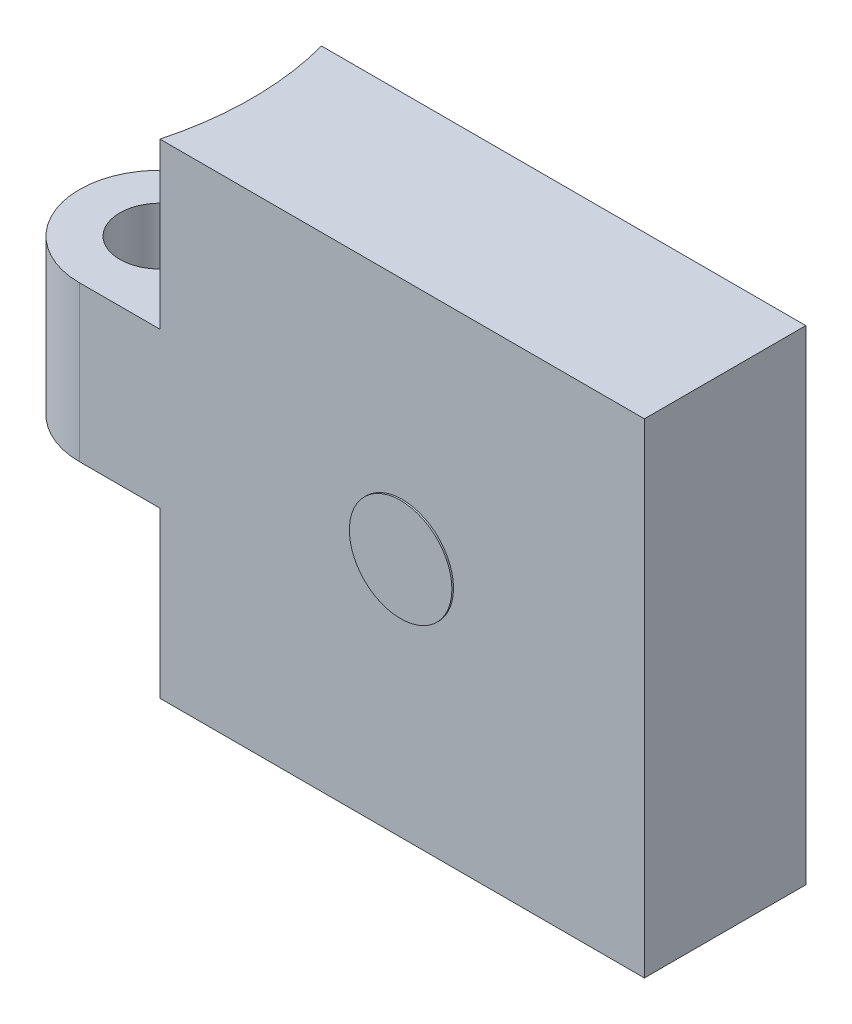
ISO-10303-21;
HEADER;
FILE_DESCRIPTION(('STEP AP214'),'2;1');
FILE_NAME('part.step','',(''),(''),'','','');
FILE_SCHEMA(('AUTOMOTIVE_DESIGN { 1 0 10303 214 1 1 1 1 }'));
ENDSEC;
DATA;
#1=APPLICATION_CONTEXT('core data for automotive mechanical design processes');
#2=APPLICATION_PROTOCOL_DEFINITION('international standard','automotive_design',2000,#1);
#3=PRODUCT_CONTEXT('',#1,'mechanical');
#4=PRODUCT('Part','Part','',(#3));
#5=PRODUCT_RELATED_PRODUCT_CATEGORY('part','',(#4));
#6=PRODUCT_DEFINITION_FORMATION('','',#4);
#7=PRODUCT_DEFINITION_CONTEXT('part definition',#1,'design');
#8=PRODUCT_DEFINITION('design','',#6,#7);
#9=PRODUCT_DEFINITION_SHAPE('','',#8);
#10=(LENGTH_UNIT() NAMED_UNIT(*) SI_UNIT(.MILLI.,.METRE.));
#11=(NAMED_UNIT(*) PLANE_ANGLE_UNIT() SI_UNIT($,.RADIAN.));
#12=(NAMED_UNIT(*) SI_UNIT($,.STERADIAN.) SOLID_ANGLE_UNIT());
#13=UNCERTAINTY_MEASURE_WITH_UNIT(LENGTH_MEASURE(1.E-05),#10,'distance_accuracy_value','');
#14=(GEOMETRIC_REPRESENTATION_CONTEXT(3) GLOBAL_UNCERTAINTY_ASSIGNED_CONTEXT((#13)) GLOBAL_UNIT_ASSIGNED_CONTEXT((#10,
#11,#12)) REPRESENTATION_CONTEXT('',''));
#15=CARTESIAN_POINT('',(0.,0.,0.));
#16=DIRECTION('',(0.,0.,1.));
#17=DIRECTION('',(1.,0.,0.));
#18=AXIS2_PLACEMENT_3D('',#15,#16,#17);
#19=CARTESIAN_POINT('',(0.,-39.0322943214974,10.));
#20=DIRECTION('',(0.,0.,1.));
#21=DIRECTION('',(1.,0.,0.));
#22=AXIS2_PLACEMENT_3D('',#19,#20,#21);
#23=PLANE('',#22);
#24=DIRECTION('',(1.,0.,0.));
#25=VECTOR('',#24,1.);
#26=CARTESIAN_POINT('',(0.,4.80000000000001,10.));
#27=LINE('',#26,#25);
#28=CARTESIAN_POINT('',(-15.,4.80000000000001,10.));
#29=VERTEX_POINT('',#28);
#30=CARTESIAN_POINT('',(-10.,4.80000000000001,10.));
#31=VERTEX_POINT('',#30);
#32=EDGE_CURVE('E221',#29,#31,#27,.T.);
#33=ORIENTED_EDGE('',*,*,#32,.F.);
#34=DIRECTION('',(0.,-1.,0.));
#35=VECTOR('',#34,1.);
#36=CARTESIAN_POINT('',(-15.,-4.79999999999999,10.));
#37=LINE('',#36,#35);
#38=CARTESIAN_POINT('',(-15.,-4.8,10.));
#39=VERTEX_POINT('',#38);
#40=EDGE_CURVE('E11',#29,#39,#37,.T.);
#41=ORIENTED_EDGE('',*,*,#40,.T.);
#42=DIRECTION('',(1.,0.,0.));
#43=VECTOR('',#42,1.);
#44=CARTESIAN_POINT('',(0.,-4.8,10.));
#45=LINE('',#44,#43);
#46=CARTESIAN_POINT('',(-10.,-4.8,10.));
#47=VERTEX_POINT('',#46);
#48=EDGE_CURVE('E164',#39,#47,#45,.T.);
#49=ORIENTED_EDGE('',*,*,#48,.T.);
#50=DIRECTION('',(0.,-1.,0.));
#51=VECTOR('',#50,1.);
#52=CARTESIAN_POINT('',(-9.99999999999999,-39.0322943214974,10.));
#53=LINE('',#52,#51);
#54=CARTESIAN_POINT('',(-10.,-5.,10.));
#55=VERTEX_POINT('',#54);
#56=EDGE_CURVE('E159',#47,#55,#53,.T.);
#57=ORIENTED_EDGE('',*,*,#56,.T.);
#58=DIRECTION('',(0.,-1.,0.));
#59=VECTOR('',#58,1.);
#60=CARTESIAN_POINT('',(-10.,-5.,10.));
#61=LINE('',#60,#59);
#62=CARTESIAN_POINT('',(-10.,-15.,10.));
#63=VERTEX_POINT('',#62);
#64=EDGE_CURVE('E194',#55,#63,#61,.T.);
#65=ORIENTED_EDGE('',*,*,#64,.T.);
#66=DIRECTION('',(1.,0.,0.));
#67=VECTOR('',#66,1.);
#68=CARTESIAN_POINT('',(0.,-15.,10.));
#69=LINE('',#68,#67);
#70=CARTESIAN_POINT('',(20.,-15.,10.));
#71=VERTEX_POINT('',#70);
#72=EDGE_CURVE('E210',#63,#71,#69,.T.);
#73=ORIENTED_EDGE('',*,*,#72,.T.);
#74=DIRECTION('',(0.,-1.,0.));
#75=VECTOR('',#74,1.);
#76=CARTESIAN_POINT('',(20.,-39.0322943214974,10.));
#77=LINE('',#76,#75);
#78=CARTESIAN_POINT('',(20.,15.,10.));
#79=VERTEX_POINT('',#78);
#80=EDGE_CURVE('E212',#79,#71,#77,.T.);
#81=ORIENTED_EDGE('',*,*,#80,.F.);
#82=DIRECTION('',(1.,0.,0.));
#83=VECTOR('',#82,1.);
#84=CARTESIAN_POINT('',(0.,15.,10.));
#85=LINE('',#84,#83);
#86=CARTESIAN_POINT('',(-10.,15.,10.));
#87=VERTEX_POINT('',#86);
#88=EDGE_CURVE('E215',#87,#79,#85,.T.);
#89=ORIENTED_EDGE('',*,*,#88,.F.);
#90=DIRECTION('',(0.,-1.,0.));
#91=VECTOR('',#90,1.);
#92=CARTESIAN_POINT('',(-10.,-39.0322943214974,10.));
#93=LINE('',#92,#91);
#94=EDGE_CURVE('E218',#87,#31,#93,.T.);
#95=ORIENTED_EDGE('',*,*,#94,.T.);
#96=EDGE_LOOP('',(#33,#41,#49,#57,#65,#73,#81,#89,#95));
#97=FACE_BOUND('',#96,.T.);
#98=CARTESIAN_POINT('',(5.,0.,10.));
#99=DIRECTION('',(0.,0.,1.));
#100=DIRECTION('',(1.,0.,0.));
#101=AXIS2_PLACEMENT_3D('',#98,#99,#100);
#102=CIRCLE('',#101,3.175);
#103=CARTESIAN_POINT('',(8.175,0.,10.));
#104=VERTEX_POINT('',#103);
#105=EDGE_CURVE('E244',#104,#104,#102,.T.);
#106=ORIENTED_EDGE('',*,*,#105,.F.);
#107=EDGE_LOOP('',(#106));
#108=FACE_BOUND('',#107,.T.);
#109=ADVANCED_FACE('F33',(#97,#108),#23,.T.);
#110=CARTESIAN_POINT('',(-9.99999999999999,-39.0322943214974,10.));
#111=DIRECTION('',(1.,0.,0.));
#112=DIRECTION('',(0.,1.,0.));
#113=AXIS2_PLACEMENT_3D('',#110,#111,#112);
#114=PLANE('',#113);
#115=DIRECTION('',(0.,-1.,0.));
#116=VECTOR('',#115,1.);
#117=CARTESIAN_POINT('',(-9.99999999999999,-39.0322943214974,0.));
#118=LINE('',#117,#116);
#119=CARTESIAN_POINT('',(-10.,-4.8,0.));
#120=VERTEX_POINT('',#119);
#121=CARTESIAN_POINT('',(-10.,-5.,0.));
#122=VERTEX_POINT('',#121);
#123=EDGE_CURVE('E207',#120,#122,#118,.T.);
#124=ORIENTED_EDGE('',*,*,#123,.T.);
#125=DIRECTION('',(0.,0.,-1.));
#126=VECTOR('',#125,1.);
#127=CARTESIAN_POINT('',(-10.,-5.,10.));
#128=LINE('',#127,#126);
#129=EDGE_CURVE('E48',#55,#122,#128,.T.);
#130=ORIENTED_EDGE('',*,*,#129,.F.);
#131=ORIENTED_EDGE('',*,*,#56,.F.);
#132=DIRECTION('',(0.,0.,-1.));
#133=VECTOR('',#132,1.);
#134=CARTESIAN_POINT('',(-10.,-4.8,10.));
#135=LINE('',#134,#133);
#136=EDGE_CURVE('E160',#47,#120,#135,.T.);
#137=ORIENTED_EDGE('',*,*,#136,.T.);
#138=EDGE_LOOP('',(#124,#130,#131,#137));
#139=FACE_BOUND('',#138,.T.);
#140=ADVANCED_FACE('F259',(#139),#114,.F.);
#141=CARTESIAN_POINT('',(0.,-15.,10.));
#142=DIRECTION('',(0.,1.,0.));
#143=DIRECTION('',(-1.,0.,0.));
#144=AXIS2_PLACEMENT_3D('',#141,#142,#143);
#145=PLANE('',#144);
#146=ORIENTED_EDGE('',*,*,#72,.F.);
#147=CARTESIAN_POINT('',(-28.6602540378443,-15.,5.));
#148=DIRECTION('',(0.,-1.,0.));
#149=DIRECTION('',(-1.,0.,0.));
#150=AXIS2_PLACEMENT_3D('',#147,#148,#149);
#151=CIRCLE('',#150,19.3185165257813);
#152=CARTESIAN_POINT('',(-10.,-15.,0.));
#153=VERTEX_POINT('',#152);
#154=EDGE_CURVE('E202',#153,#63,#151,.T.);
#155=ORIENTED_EDGE('',*,*,#154,.F.);
#156=DIRECTION('',(1.,0.,0.));
#157=VECTOR('',#156,1.);
#158=CARTESIAN_POINT('',(0.,-15.,0.));
#159=LINE('',#158,#157);
#160=CARTESIAN_POINT('',(20.,-15.,0.));
#161=VERTEX_POINT('',#160);
#162=EDGE_CURVE('E226',#153,#161,#159,.T.);
#163=ORIENTED_EDGE('',*,*,#162,.T.);
#164=DIRECTION('',(0.,0.,-1.));
#165=VECTOR('',#164,1.);
#166=CARTESIAN_POINT('',(20.,-15.,10.));
#167=LINE('',#166,#165);
#168=EDGE_CURVE('E170',#71,#161,#167,.T.);
#169=ORIENTED_EDGE('',*,*,#168,.F.);
#170=EDGE_LOOP('',(#146,#155,#163,#169));
#171=FACE_BOUND('',#170,.T.);
#172=ADVANCED_FACE('F237',(#171),#145,.F.);
#173=CARTESIAN_POINT('',(20.,-39.0322943214974,10.));
#174=DIRECTION('',(1.,0.,0.));
#175=DIRECTION('',(0.,1.,0.));
#176=AXIS2_PLACEMENT_3D('',#173,#174,#175);
#177=PLANE('',#176);
#178=DIRECTION('',(0.,-1.,0.));
#179=VECTOR('',#178,1.);
#180=CARTESIAN_POINT('',(20.,-39.0322943214974,0.));
#181=LINE('',#180,#179);
#182=CARTESIAN_POINT('',(20.,15.,0.));
#183=VERTEX_POINT('',#182);
#184=EDGE_CURVE('E152',#183,#161,#181,.T.);
#185=ORIENTED_EDGE('',*,*,#184,.F.);
#186=DIRECTION('',(0.,0.,-1.));
#187=VECTOR('',#186,1.);
#188=CARTESIAN_POINT('',(20.,15.,10.));
#189=LINE('',#188,#187);
#190=EDGE_CURVE('E168',#79,#183,#189,.T.);
#191=ORIENTED_EDGE('',*,*,#190,.F.);
#192=ORIENTED_EDGE('',*,*,#80,.T.);
#193=ORIENTED_EDGE('',*,*,#168,.T.);
#194=EDGE_LOOP('',(#185,#191,#192,#193));
#195=FACE_BOUND('',#194,.T.);
#196=ADVANCED_FACE('F232',(#195),#177,.T.);
#197=CARTESIAN_POINT('',(0.,15.,10.));
#198=DIRECTION('',(0.,1.,0.));
#199=DIRECTION('',(0.,0.,1.));
#200=AXIS2_PLACEMENT_3D('',#197,#198,#199);
#201=PLANE('',#200);
#202=CARTESIAN_POINT('',(-28.5679721298959,15.,4.97527313728922));
#203=DIRECTION('',(0.,1.,0.));
#204=DIRECTION('',(0.,0.,-1.));
#205=AXIS2_PLACEMENT_3D('',#202,#203,#204);
#206=CIRCLE('',#205,19.2229792645995);
#207=CARTESIAN_POINT('',(-10.,15.,9.95054627457844));
#208=VERTEX_POINT('',#207);
#209=CARTESIAN_POINT('',(-10.,15.,0.));
#210=VERTEX_POINT('',#209);
#211=EDGE_CURVE('E125',#208,#210,#206,.T.);
#212=ORIENTED_EDGE('',*,*,#211,.F.);
#213=DIRECTION('',(0.,0.,-1.));
#214=VECTOR('',#213,1.);
#215=CARTESIAN_POINT('',(-10.,15.,10.));
#216=LINE('',#215,#214);
#217=EDGE_CURVE('E166',#87,#208,#216,.T.);
#218=ORIENTED_EDGE('',*,*,#217,.F.);
#219=ORIENTED_EDGE('',*,*,#88,.T.);
#220=ORIENTED_EDGE('',*,*,#190,.T.);
#221=DIRECTION('',(1.,0.,0.));
#222=VECTOR('',#221,1.);
#223=CARTESIAN_POINT('',(0.,15.,0.));
#224=LINE('',#223,#222);
#225=EDGE_CURVE('E151',#210,#183,#224,.T.);
#226=ORIENTED_EDGE('',*,*,#225,.F.);
#227=EDGE_LOOP('',(#212,#218,#219,#220,#226));
#228=FACE_BOUND('',#227,.T.);
#229=ADVANCED_FACE('F284',(#228),#201,.T.);
#230=CARTESIAN_POINT('',(-10.,-39.0322943214974,10.));
#231=DIRECTION('',(1.,0.,0.));
#232=DIRECTION('',(0.,0.,-1.));
#233=AXIS2_PLACEMENT_3D('',#230,#231,#232);
#234=PLANE('',#233);
#235=ORIENTED_EDGE('',*,*,#217,.T.);
#236=DIRECTION('',(0.,1.,0.));
#237=VECTOR('',#236,1.);
#238=CARTESIAN_POINT('',(-10.,5.,9.95054627457844));
#239=LINE('',#238,#237);
#240=CARTESIAN_POINT('',(-10.,5.,9.95054627457844));
#241=VERTEX_POINT('',#240);
#242=EDGE_CURVE('E144',#241,#208,#239,.T.);
#243=ORIENTED_EDGE('',*,*,#242,.F.);
#244=DIRECTION('',(0.,0.,1.));
#245=VECTOR('',#244,1.);
#246=CARTESIAN_POINT('',(-10.,5.,9.95054627457844));
#247=LINE('',#246,#245);
#248=CARTESIAN_POINT('',(-10.,5.,0.));
#249=VERTEX_POINT('',#248);
#250=EDGE_CURVE('E136',#249,#241,#247,.T.);
#251=ORIENTED_EDGE('',*,*,#250,.F.);
#252=DIRECTION('',(0.,-1.,0.));
#253=VECTOR('',#252,1.);
#254=CARTESIAN_POINT('',(-10.,-39.0322943214974,0.));
#255=LINE('',#254,#253);
#256=CARTESIAN_POINT('',(-10.,4.80000000000001,0.));
#257=VERTEX_POINT('',#256);
#258=EDGE_CURVE('E131',#249,#257,#255,.T.);
#259=ORIENTED_EDGE('',*,*,#258,.T.);
#260=DIRECTION('',(0.,0.,-1.));
#261=VECTOR('',#260,1.);
#262=CARTESIAN_POINT('',(-10.,4.80000000000001,10.));
#263=LINE('',#262,#261);
#264=EDGE_CURVE('E163',#31,#257,#263,.T.);
#265=ORIENTED_EDGE('',*,*,#264,.F.);
#266=ORIENTED_EDGE('',*,*,#94,.F.);
#267=EDGE_LOOP('',(#235,#243,#251,#259,#265,#266));
#268=FACE_BOUND('',#267,.T.);
#269=ADVANCED_FACE('F141',(#268),#234,.F.);
#270=CARTESIAN_POINT('',(0.,4.80000000000001,10.));
#271=DIRECTION('',(0.,1.,0.));
#272=DIRECTION('',(-1.,0.,0.));
#273=AXIS2_PLACEMENT_3D('',#270,#271,#272);
#274=PLANE('',#273);
#275=CARTESIAN_POINT('',(-15.,4.80000000000001,5.));
#276=DIRECTION('',(0.,1.,0.));
#277=DIRECTION('',(-1.,0.,0.));
#278=AXIS2_PLACEMENT_3D('',#275,#276,#277);
#279=CIRCLE('',#278,2.5);
#280=CARTESIAN_POINT('',(-17.5,4.80000000000001,5.));
#281=VERTEX_POINT('',#280);
#282=EDGE_CURVE('E192',#281,#281,#279,.T.);
#283=ORIENTED_EDGE('',*,*,#282,.F.);
#284=EDGE_LOOP('',(#283));
#285=FACE_BOUND('',#284,.T.);
#286=DIRECTION('',(1.,0.,0.));
#287=VECTOR('',#286,1.);
#288=CARTESIAN_POINT('',(0.,4.80000000000001,0.));
#289=LINE('',#288,#287);
#290=CARTESIAN_POINT('',(-15.,4.80000000000001,0.));
#291=VERTEX_POINT('',#290);
#292=EDGE_CURVE('E130',#291,#257,#289,.T.);
#293=ORIENTED_EDGE('',*,*,#292,.F.);
#294=CARTESIAN_POINT('',(-15.,4.80000000000001,5.));
#295=DIRECTION('',(0.,1.,0.));
#296=DIRECTION('',(-1.,0.,0.));
#297=AXIS2_PLACEMENT_3D('',#294,#295,#296);
#298=CIRCLE('',#297,5.);
#299=CARTESIAN_POINT('',(-20.,4.8,5.));
#300=VERTEX_POINT('',#299);
#301=EDGE_CURVE('E42',#291,#300,#298,.T.);
#302=ORIENTED_EDGE('',*,*,#301,.T.);
#303=CARTESIAN_POINT('',(-15.,4.80000000000001,5.));
#304=DIRECTION('',(0.,1.,0.));
#305=DIRECTION('',(-1.,0.,0.));
#306=AXIS2_PLACEMENT_3D('',#303,#304,#305);
#307=CIRCLE('',#306,5.);
#308=EDGE_CURVE('E56',#300,#29,#307,.T.);
#309=ORIENTED_EDGE('',*,*,#308,.T.);
#310=ORIENTED_EDGE('',*,*,#32,.T.);
#311=ORIENTED_EDGE('',*,*,#264,.T.);
#312=EDGE_LOOP('',(#293,#302,#309,#310,#311));
#313=FACE_BOUND('',#312,.T.);
#314=ADVANCED_FACE('F179',(#285,#313),#274,.T.);
#315=CARTESIAN_POINT('',(0.,-4.8,10.));
#316=DIRECTION('',(0.,1.,0.));
#317=DIRECTION('',(0.,0.,1.));
#318=AXIS2_PLACEMENT_3D('',#315,#316,#317);
#319=PLANE('',#318);
#320=CARTESIAN_POINT('',(-15.,-4.8,5.));
#321=DIRECTION('',(0.,-1.,0.));
#322=DIRECTION('',(0.,0.,-1.));
#323=AXIS2_PLACEMENT_3D('',#320,#321,#322);
#324=CIRCLE('',#323,2.5);
#325=CARTESIAN_POINT('',(-15.,-4.8,2.5));
#326=VERTEX_POINT('',#325);
#327=EDGE_CURVE('E189',#326,#326,#324,.T.);
#328=ORIENTED_EDGE('',*,*,#327,.F.);
#329=EDGE_LOOP('',(#328));
#330=FACE_BOUND('',#329,.T.);
#331=CARTESIAN_POINT('',(-15.,-4.8,5.));
#332=DIRECTION('',(0.,1.,0.));
#333=DIRECTION('',(0.,0.,1.));
#334=AXIS2_PLACEMENT_3D('',#331,#332,#333);
#335=CIRCLE('',#334,5.);
#336=CARTESIAN_POINT('',(-20.,-4.79999999999999,5.));
#337=VERTEX_POINT('',#336);
#338=EDGE_CURVE('E172',#39,#337,#335,.F.);
#339=ORIENTED_EDGE('',*,*,#338,.T.);
#340=CARTESIAN_POINT('',(-15.,-4.8,5.));
#341=DIRECTION('',(0.,1.,0.));
#342=DIRECTION('',(0.,0.,1.));
#343=AXIS2_PLACEMENT_3D('',#340,#341,#342);
#344=CIRCLE('',#343,5.);
#345=CARTESIAN_POINT('',(-15.,-4.8,0.));
#346=VERTEX_POINT('',#345);
#347=EDGE_CURVE('E174',#337,#346,#344,.F.);
#348=ORIENTED_EDGE('',*,*,#347,.T.);
#349=DIRECTION('',(1.,0.,0.));
#350=VECTOR('',#349,1.);
#351=CARTESIAN_POINT('',(0.,-4.8,0.));
#352=LINE('',#351,#350);
#353=EDGE_CURVE('E157',#346,#120,#352,.T.);
#354=ORIENTED_EDGE('',*,*,#353,.T.);
#355=ORIENTED_EDGE('',*,*,#136,.F.);
#356=ORIENTED_EDGE('',*,*,#48,.F.);
#357=EDGE_LOOP('',(#339,#348,#354,#355,#356));
#358=FACE_BOUND('',#357,.T.);
#359=ADVANCED_FACE('F275',(#330,#358),#319,.F.);
#360=CARTESIAN_POINT('',(0.,-39.0322943214974,0.));
#361=DIRECTION('',(0.,0.,1.));
#362=DIRECTION('',(1.,0.,0.));
#363=AXIS2_PLACEMENT_3D('',#360,#361,#362);
#364=PLANE('',#363);
#365=ORIENTED_EDGE('',*,*,#353,.F.);
#366=DIRECTION('',(0.,-1.,0.));
#367=VECTOR('',#366,1.);
#368=CARTESIAN_POINT('',(-15.,-39.0322943214974,0.));
#369=LINE('',#368,#367);
#370=EDGE_CURVE('E176',#346,#291,#369,.F.);
#371=ORIENTED_EDGE('',*,*,#370,.T.);
#372=ORIENTED_EDGE('',*,*,#292,.T.);
#373=ORIENTED_EDGE('',*,*,#258,.F.);
#374=EDGE_CURVE('E119',#210,#249,#255,.T.);
#375=ORIENTED_EDGE('',*,*,#374,.F.);
#376=ORIENTED_EDGE('',*,*,#225,.T.);
#377=ORIENTED_EDGE('',*,*,#184,.T.);
#378=ORIENTED_EDGE('',*,*,#162,.F.);
#379=DIRECTION('',(0.,-1.,0.));
#380=VECTOR('',#379,1.);
#381=CARTESIAN_POINT('',(-10.,-5.,0.));
#382=LINE('',#381,#380);
#383=EDGE_CURVE('E190',#122,#153,#382,.T.);
#384=ORIENTED_EDGE('',*,*,#383,.F.);
#385=ORIENTED_EDGE('',*,*,#123,.F.);
#386=EDGE_LOOP('',(#365,#371,#372,#373,#375,#376,#377,#378,#384,#385));
#387=FACE_BOUND('',#386,.T.);
#388=ADVANCED_FACE('F147',(#387),#364,.F.);
#389=CARTESIAN_POINT('',(-15.,5.2,5.));
#390=DIRECTION('',(0.,-1.,0.));
#391=DIRECTION('',(0.,0.,-1.));
#392=AXIS2_PLACEMENT_3D('',#389,#390,#391);
#393=CYLINDRICAL_SURFACE('',#392,2.5);
#394=ORIENTED_EDGE('',*,*,#282,.T.);
#395=EDGE_LOOP('',(#394));
#396=FACE_BOUND('',#395,.T.);
#397=ORIENTED_EDGE('',*,*,#327,.T.);
#398=EDGE_LOOP('',(#397));
#399=FACE_BOUND('',#398,.T.);
#400=ADVANCED_FACE('F271',(#396,#399),#393,.F.);
#401=CARTESIAN_POINT('',(-15.,-39.0322943214974,5.));
#402=DIRECTION('',(0.,1.,0.));
#403=DIRECTION('',(0.,0.,1.));
#404=AXIS2_PLACEMENT_3D('',#401,#402,#403);
#405=CYLINDRICAL_SURFACE('',#404,5.);
#406=ORIENTED_EDGE('',*,*,#40,.F.);
#407=ORIENTED_EDGE('',*,*,#308,.F.);
#408=DIRECTION('',(0.,-1.,0.));
#409=VECTOR('',#408,1.);
#410=CARTESIAN_POINT('',(-20.,4.8,5.));
#411=LINE('',#410,#409);
#412=EDGE_CURVE('E37',#337,#300,#411,.F.);
#413=ORIENTED_EDGE('',*,*,#412,.F.);
#414=ORIENTED_EDGE('',*,*,#338,.F.);
#415=EDGE_LOOP('',(#406,#407,#413,#414));
#416=FACE_BOUND('',#415,.T.);
#417=ADVANCED_FACE('F35',(#416),#405,.T.);
#418=CARTESIAN_POINT('',(-15.,-39.0322943214974,5.));
#419=DIRECTION('',(0.,-1.,0.));
#420=DIRECTION('',(0.,0.,-1.));
#421=AXIS2_PLACEMENT_3D('',#418,#419,#420);
#422=CYLINDRICAL_SURFACE('',#421,5.);
#423=ORIENTED_EDGE('',*,*,#301,.F.);
#424=ORIENTED_EDGE('',*,*,#370,.F.);
#425=ORIENTED_EDGE('',*,*,#347,.F.);
#426=ORIENTED_EDGE('',*,*,#412,.T.);
#427=EDGE_LOOP('',(#423,#424,#425,#426));
#428=FACE_BOUND('',#427,.T.);
#429=ADVANCED_FACE('F188',(#428),#422,.T.);
#430=CARTESIAN_POINT('',(-28.6602540378443,-5.,5.));
#431=DIRECTION('',(0.,-1.,0.));
#432=DIRECTION('',(1.,0.,0.));
#433=AXIS2_PLACEMENT_3D('',#430,#431,#432);
#434=CYLINDRICAL_SURFACE('',#433,19.3185165257813);
#435=ORIENTED_EDGE('',*,*,#154,.T.);
#436=ORIENTED_EDGE('',*,*,#64,.F.);
#437=CARTESIAN_POINT('',(-28.6602540378443,-5.,5.));
#438=DIRECTION('',(0.,-1.,0.));
#439=DIRECTION('',(-1.,0.,0.));
#440=AXIS2_PLACEMENT_3D('',#437,#438,#439);
#441=CIRCLE('',#440,19.3185165257813);
#442=EDGE_CURVE('E238',#122,#55,#441,.T.);
#443=ORIENTED_EDGE('',*,*,#442,.F.);
#444=ORIENTED_EDGE('',*,*,#383,.T.);
#445=EDGE_LOOP('',(#435,#436,#443,#444));
#446=FACE_BOUND('',#445,.T.);
#447=ADVANCED_FACE('F292',(#446),#434,.F.);
#448=CARTESIAN_POINT('',(-28.6602540378443,-5.,5.));
#449=DIRECTION('',(0.,1.,0.));
#450=DIRECTION('',(-1.,0.,0.));
#451=AXIS2_PLACEMENT_3D('',#448,#449,#450);
#452=PLANE('',#451);
#453=ORIENTED_EDGE('',*,*,#442,.T.);
#454=ORIENTED_EDGE('',*,*,#129,.T.);
#455=EDGE_LOOP('',(#453,#454));
#456=FACE_BOUND('',#455,.T.);
#457=ADVANCED_FACE('F297',(#456),#452,.F.);
#458=CARTESIAN_POINT('',(-28.5679721298959,5.,4.97527313728922));
#459=DIRECTION('',(0.,1.,0.));
#460=DIRECTION('',(0.,0.,1.));
#461=AXIS2_PLACEMENT_3D('',#458,#459,#460);
#462=CYLINDRICAL_SURFACE('',#461,19.2229792645995);
#463=ORIENTED_EDGE('',*,*,#211,.T.);
#464=ORIENTED_EDGE('',*,*,#374,.T.);
#465=CARTESIAN_POINT('',(-28.5679721298959,5.,4.97527313728922));
#466=DIRECTION('',(0.,1.,0.));
#467=DIRECTION('',(0.,0.,-1.));
#468=AXIS2_PLACEMENT_3D('',#465,#466,#467);
#469=CIRCLE('',#468,19.2229792645995);
#470=EDGE_CURVE('E122',#241,#249,#469,.T.);
#471=ORIENTED_EDGE('',*,*,#470,.F.);
#472=ORIENTED_EDGE('',*,*,#242,.T.);
#473=EDGE_LOOP('',(#463,#464,#471,#472));
#474=FACE_BOUND('',#473,.T.);
#475=ADVANCED_FACE('F121',(#474),#462,.F.);
#476=CARTESIAN_POINT('',(-28.5679721298959,5.,4.97527313728922));
#477=DIRECTION('',(0.,-1.,0.));
#478=DIRECTION('',(0.,0.,-1.));
#479=AXIS2_PLACEMENT_3D('',#476,#477,#478);
#480=PLANE('',#479);
#481=ORIENTED_EDGE('',*,*,#470,.T.);
#482=ORIENTED_EDGE('',*,*,#250,.T.);
#483=EDGE_LOOP('',(#481,#482));
#484=FACE_BOUND('',#483,.T.);
#485=ADVANCED_FACE('F135',(#484),#480,.F.);
#486=CARTESIAN_POINT('',(5.,0.,10.1));
#487=DIRECTION('',(0.,0.,-1.));
#488=DIRECTION('',(-1.,0.,0.));
#489=AXIS2_PLACEMENT_3D('',#486,#487,#488);
#490=CYLINDRICAL_SURFACE('',#489,3.175);
#491=CARTESIAN_POINT('',(5.,0.,10.1));
#492=DIRECTION('',(0.,0.,1.));
#493=DIRECTION('',(1.,0.,0.));
#494=AXIS2_PLACEMENT_3D('',#491,#492,#493);
#495=CIRCLE('',#494,3.175);
#496=CARTESIAN_POINT('',(8.175,0.,10.1));
#497=VERTEX_POINT('',#496);
#498=EDGE_CURVE('E242',#497,#497,#495,.T.);
#499=ORIENTED_EDGE('',*,*,#498,.F.);
#500=EDGE_LOOP('',(#499));
#501=FACE_BOUND('',#500,.T.);
#502=ORIENTED_EDGE('',*,*,#105,.T.);
#503=EDGE_LOOP('',(#502));
#504=FACE_BOUND('',#503,.T.);
#505=ADVANCED_FACE('F252',(#501,#504),#490,.T.);
#506=CARTESIAN_POINT('',(5.,0.,10.1));
#507=DIRECTION('',(0.,0.,1.));
#508=DIRECTION('',(1.,0.,0.));
#509=AXIS2_PLACEMENT_3D('',#506,#507,#508);
#510=PLANE('',#509);
#511=ORIENTED_EDGE('',*,*,#498,.T.);
#512=EDGE_LOOP('',(#511));
#513=FACE_BOUND('',#512,.T.);
#514=ADVANCED_FACE('F250',(#513),#510,.T.);
#515=CLOSED_SHELL('',(#109,#140,#172,#196,#229,#269,#314,#359,#388,#400,#417,#429,#447,#457,
#475,#485,#505,#514));
#516=MANIFOLD_SOLID_BREP('B2',#515);
#517=ADVANCED_BREP_SHAPE_REPRESENTATION('',(#18,#516),#14);
#518=SHAPE_DEFINITION_REPRESENTATION(#9,#517);
ENDSEC;
END-ISO-10303-21;
